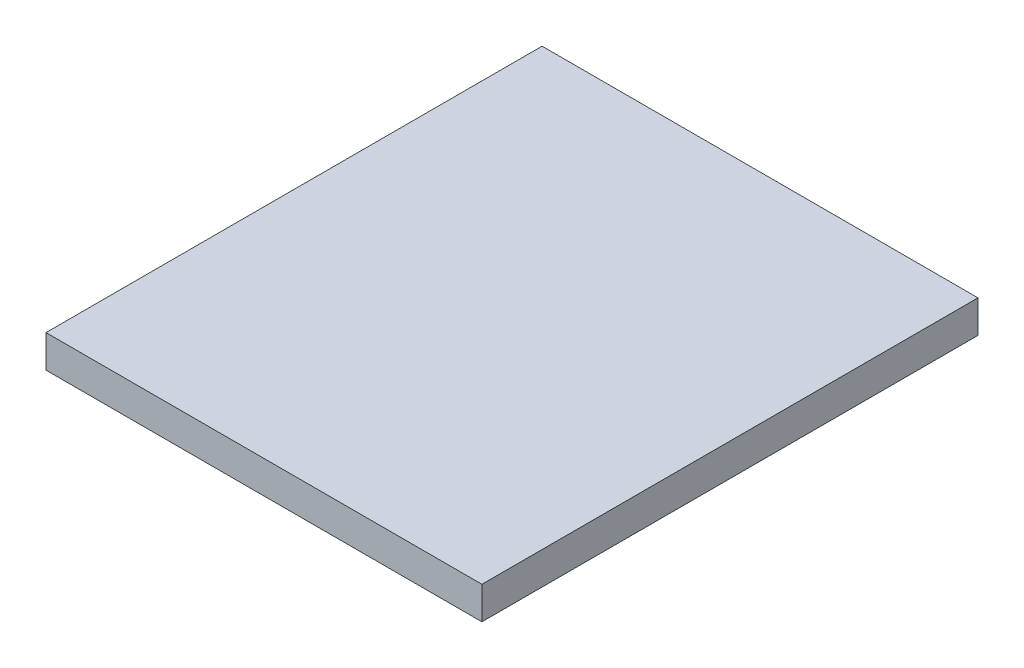
ISO-10303-21;
HEADER;
FILE_DESCRIPTION(('STEP AP214'),'2;1');
FILE_NAME('part.step','',(''),(''),'','','');
FILE_SCHEMA(('AUTOMOTIVE_DESIGN { 1 0 10303 214 1 1 1 1 }'));
ENDSEC;
DATA;
#1=APPLICATION_CONTEXT('core data for automotive mechanical design processes');
#2=APPLICATION_PROTOCOL_DEFINITION('international standard','automotive_design',2000,#1);
#3=PRODUCT_CONTEXT('',#1,'mechanical');
#4=PRODUCT('Part','Part','',(#3));
#5=PRODUCT_RELATED_PRODUCT_CATEGORY('part','',(#4));
#6=PRODUCT_DEFINITION_FORMATION('','',#4);
#7=PRODUCT_DEFINITION_CONTEXT('part definition',#1,'design');
#8=PRODUCT_DEFINITION('design','',#6,#7);
#9=PRODUCT_DEFINITION_SHAPE('','',#8);
#10=(LENGTH_UNIT() NAMED_UNIT(*) SI_UNIT(.MILLI.,.METRE.));
#11=(NAMED_UNIT(*) PLANE_ANGLE_UNIT() SI_UNIT($,.RADIAN.));
#12=(NAMED_UNIT(*) SI_UNIT($,.STERADIAN.) SOLID_ANGLE_UNIT());
#13=UNCERTAINTY_MEASURE_WITH_UNIT(LENGTH_MEASURE(1.E-05),#10,'distance_accuracy_value','');
#14=(GEOMETRIC_REPRESENTATION_CONTEXT(3) GLOBAL_UNCERTAINTY_ASSIGNED_CONTEXT((#13)) GLOBAL_UNIT_ASSIGNED_CONTEXT((#10,
#11,#12)) REPRESENTATION_CONTEXT('',''));
#15=CARTESIAN_POINT('',(0.,0.,0.));
#16=DIRECTION('',(0.,0.,1.));
#17=DIRECTION('',(1.,0.,0.));
#18=AXIS2_PLACEMENT_3D('',#15,#16,#17);
#19=CARTESIAN_POINT('',(17.018,2.54,19.3675));
#20=DIRECTION('',(-1.,0.,0.));
#21=DIRECTION('',(0.,0.,1.));
#22=AXIS2_PLACEMENT_3D('',#19,#20,#21);
#23=PLANE('',#22);
#24=DIRECTION('',(0.,0.,-1.));
#25=VECTOR('',#24,1.);
#26=CARTESIAN_POINT('',(17.018,0.,19.3675));
#27=LINE('',#26,#25);
#28=CARTESIAN_POINT('',(17.018,0.,19.3675));
#29=VERTEX_POINT('',#28);
#30=CARTESIAN_POINT('',(17.018,0.,-19.3675));
#31=VERTEX_POINT('',#30);
#32=EDGE_CURVE('E113',#29,#31,#27,.T.);
#33=ORIENTED_EDGE('',*,*,#32,.T.);
#34=DIRECTION('',(0.,-1.,0.));
#35=VECTOR('',#34,1.);
#36=CARTESIAN_POINT('',(17.018,2.54,-19.3675));
#37=LINE('',#36,#35);
#38=CARTESIAN_POINT('',(17.018,2.54,-19.3675));
#39=VERTEX_POINT('',#38);
#40=EDGE_CURVE('E11',#39,#31,#37,.T.);
#41=ORIENTED_EDGE('',*,*,#40,.F.);
#42=DIRECTION('',(0.,0.,-1.));
#43=VECTOR('',#42,1.);
#44=CARTESIAN_POINT('',(17.018,2.54,19.3675));
#45=LINE('',#44,#43);
#46=CARTESIAN_POINT('',(17.018,2.54,19.3675));
#47=VERTEX_POINT('',#46);
#48=EDGE_CURVE('E97',#47,#39,#45,.T.);
#49=ORIENTED_EDGE('',*,*,#48,.F.);
#50=DIRECTION('',(0.,-1.,0.));
#51=VECTOR('',#50,1.);
#52=CARTESIAN_POINT('',(17.018,2.54,19.3675));
#53=LINE('',#52,#51);
#54=EDGE_CURVE('E109',#47,#29,#53,.T.);
#55=ORIENTED_EDGE('',*,*,#54,.T.);
#56=EDGE_LOOP('',(#33,#41,#49,#55));
#57=FACE_BOUND('',#56,.T.);
#58=ADVANCED_FACE('F45',(#57),#23,.F.);
#59=CARTESIAN_POINT('',(-17.018,2.54,-19.3675));
#60=DIRECTION('',(0.,0.,1.));
#61=DIRECTION('',(1.,0.,0.));
#62=AXIS2_PLACEMENT_3D('',#59,#60,#61);
#63=PLANE('',#62);
#64=DIRECTION('',(-1.,0.,0.));
#65=VECTOR('',#64,1.);
#66=CARTESIAN_POINT('',(-17.018,0.,-19.3675));
#67=LINE('',#66,#65);
#68=CARTESIAN_POINT('',(-17.018,0.,-19.3675));
#69=VERTEX_POINT('',#68);
#70=EDGE_CURVE('E102',#31,#69,#67,.T.);
#71=ORIENTED_EDGE('',*,*,#70,.T.);
#72=DIRECTION('',(0.,-1.,0.));
#73=VECTOR('',#72,1.);
#74=CARTESIAN_POINT('',(-17.018,2.54,-19.3675));
#75=LINE('',#74,#73);
#76=CARTESIAN_POINT('',(-17.018,2.54,-19.3675));
#77=VERTEX_POINT('',#76);
#78=EDGE_CURVE('E54',#77,#69,#75,.T.);
#79=ORIENTED_EDGE('',*,*,#78,.F.);
#80=DIRECTION('',(-1.,0.,0.));
#81=VECTOR('',#80,1.);
#82=CARTESIAN_POINT('',(-17.018,2.54,-19.3675));
#83=LINE('',#82,#81);
#84=EDGE_CURVE('E92',#39,#77,#83,.T.);
#85=ORIENTED_EDGE('',*,*,#84,.F.);
#86=ORIENTED_EDGE('',*,*,#40,.T.);
#87=EDGE_LOOP('',(#71,#79,#85,#86));
#88=FACE_BOUND('',#87,.T.);
#89=ADVANCED_FACE('F101',(#88),#63,.F.);
#90=CARTESIAN_POINT('',(-17.018,2.54,19.3675));
#91=DIRECTION('',(1.,0.,0.));
#92=DIRECTION('',(0.,0.,-1.));
#93=AXIS2_PLACEMENT_3D('',#90,#91,#92);
#94=PLANE('',#93);
#95=DIRECTION('',(0.,0.,1.));
#96=VECTOR('',#95,1.);
#97=CARTESIAN_POINT('',(-17.018,0.,19.3675));
#98=LINE('',#97,#96);
#99=CARTESIAN_POINT('',(-17.018,0.,19.3675));
#100=VERTEX_POINT('',#99);
#101=EDGE_CURVE('E79',#69,#100,#98,.T.);
#102=ORIENTED_EDGE('',*,*,#101,.T.);
#103=DIRECTION('',(0.,-1.,0.));
#104=VECTOR('',#103,1.);
#105=CARTESIAN_POINT('',(-17.018,2.54,19.3675));
#106=LINE('',#105,#104);
#107=CARTESIAN_POINT('',(-17.018,2.54,19.3675));
#108=VERTEX_POINT('',#107);
#109=EDGE_CURVE('E104',#108,#100,#106,.T.);
#110=ORIENTED_EDGE('',*,*,#109,.F.);
#111=DIRECTION('',(0.,0.,1.));
#112=VECTOR('',#111,1.);
#113=CARTESIAN_POINT('',(-17.018,2.54,19.3675));
#114=LINE('',#113,#112);
#115=EDGE_CURVE('E95',#77,#108,#114,.T.);
#116=ORIENTED_EDGE('',*,*,#115,.F.);
#117=ORIENTED_EDGE('',*,*,#78,.T.);
#118=EDGE_LOOP('',(#102,#110,#116,#117));
#119=FACE_BOUND('',#118,.T.);
#120=ADVANCED_FACE('F105',(#119),#94,.F.);
#121=CARTESIAN_POINT('',(-17.018,2.54,19.3675));
#122=DIRECTION('',(0.,0.,-1.));
#123=DIRECTION('',(-1.,0.,0.));
#124=AXIS2_PLACEMENT_3D('',#121,#122,#123);
#125=PLANE('',#124);
#126=DIRECTION('',(1.,0.,0.));
#127=VECTOR('',#126,1.);
#128=CARTESIAN_POINT('',(-17.018,0.,19.3675));
#129=LINE('',#128,#127);
#130=EDGE_CURVE('E85',#100,#29,#129,.T.);
#131=ORIENTED_EDGE('',*,*,#130,.T.);
#132=ORIENTED_EDGE('',*,*,#54,.F.);
#133=DIRECTION('',(1.,0.,0.));
#134=VECTOR('',#133,1.);
#135=CARTESIAN_POINT('',(-17.018,2.54,19.3675));
#136=LINE('',#135,#134);
#137=EDGE_CURVE('E62',#108,#47,#136,.T.);
#138=ORIENTED_EDGE('',*,*,#137,.F.);
#139=ORIENTED_EDGE('',*,*,#109,.T.);
#140=EDGE_LOOP('',(#131,#132,#138,#139));
#141=FACE_BOUND('',#140,.T.);
#142=ADVANCED_FACE('F126',(#141),#125,.F.);
#143=CARTESIAN_POINT('',(0.,2.54,0.));
#144=DIRECTION('',(0.,-1.,0.));
#145=DIRECTION('',(0.,0.,-1.));
#146=AXIS2_PLACEMENT_3D('',#143,#144,#145);
#147=PLANE('',#146);
#148=ORIENTED_EDGE('',*,*,#48,.T.);
#149=ORIENTED_EDGE('',*,*,#84,.T.);
#150=ORIENTED_EDGE('',*,*,#115,.T.);
#151=ORIENTED_EDGE('',*,*,#137,.T.);
#152=EDGE_LOOP('',(#148,#149,#150,#151));
#153=FACE_BOUND('',#152,.T.);
#154=ADVANCED_FACE('F93',(#153),#147,.F.);
#155=CARTESIAN_POINT('',(0.,0.,0.));
#156=DIRECTION('',(0.,-1.,0.));
#157=DIRECTION('',(0.,0.,-1.));
#158=AXIS2_PLACEMENT_3D('',#155,#156,#157);
#159=PLANE('',#158);
#160=ORIENTED_EDGE('',*,*,#32,.F.);
#161=ORIENTED_EDGE('',*,*,#130,.F.);
#162=ORIENTED_EDGE('',*,*,#101,.F.);
#163=ORIENTED_EDGE('',*,*,#70,.F.);
#164=EDGE_LOOP('',(#160,#161,#162,#163));
#165=FACE_BOUND('',#164,.T.);
#166=ADVANCED_FACE('F129',(#165),#159,.T.);
#167=CLOSED_SHELL('',(#58,#89,#120,#142,#154,#166));
#168=MANIFOLD_SOLID_BREP('B2',#167);
#169=ADVANCED_BREP_SHAPE_REPRESENTATION('',(#18,#168),#14);
#170=SHAPE_DEFINITION_REPRESENTATION(#9,#169);
ENDSEC;
END-ISO-10303-21;
